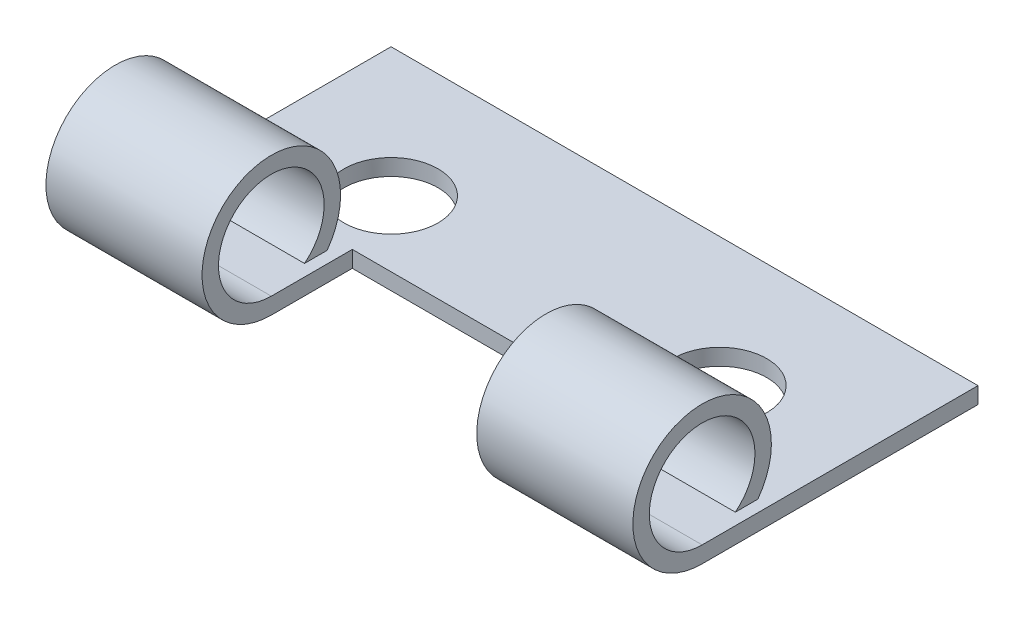
ISO-10303-21;
HEADER;
FILE_DESCRIPTION(('STEP AP214'),'2;1');
FILE_NAME('part.step','',(''),(''),'','','');
FILE_SCHEMA(('AUTOMOTIVE_DESIGN { 1 0 10303 214 1 1 1 1 }'));
ENDSEC;
DATA;
#1=APPLICATION_CONTEXT('core data for automotive mechanical design processes');
#2=APPLICATION_PROTOCOL_DEFINITION('international standard','automotive_design',2000,#1);
#3=PRODUCT_CONTEXT('',#1,'mechanical');
#4=PRODUCT('Part','Part','',(#3));
#5=PRODUCT_RELATED_PRODUCT_CATEGORY('part','',(#4));
#6=PRODUCT_DEFINITION_FORMATION('','',#4);
#7=PRODUCT_DEFINITION_CONTEXT('part definition',#1,'design');
#8=PRODUCT_DEFINITION('design','',#6,#7);
#9=PRODUCT_DEFINITION_SHAPE('','',#8);
#10=(LENGTH_UNIT() NAMED_UNIT(*) SI_UNIT(.MILLI.,.METRE.));
#11=(NAMED_UNIT(*) PLANE_ANGLE_UNIT() SI_UNIT($,.RADIAN.));
#12=(NAMED_UNIT(*) SI_UNIT($,.STERADIAN.) SOLID_ANGLE_UNIT());
#13=UNCERTAINTY_MEASURE_WITH_UNIT(LENGTH_MEASURE(1.E-05),#10,'distance_accuracy_value','');
#14=(GEOMETRIC_REPRESENTATION_CONTEXT(3) GLOBAL_UNCERTAINTY_ASSIGNED_CONTEXT((#13)) GLOBAL_UNIT_ASSIGNED_CONTEXT((#10,
#11,#12)) REPRESENTATION_CONTEXT('',''));
#15=CARTESIAN_POINT('',(0.,0.,0.));
#16=DIRECTION('',(0.,0.,1.));
#17=DIRECTION('',(1.,0.,0.));
#18=AXIS2_PLACEMENT_3D('',#15,#16,#17);
#19=CARTESIAN_POINT('',(12.5,0.,-2.25));
#20=DIRECTION('',(0.,1.,0.));
#21=DIRECTION('',(0.,0.,1.));
#22=AXIS2_PLACEMENT_3D('',#19,#20,#21);
#23=PLANE('',#22);
#24=CARTESIAN_POINT('',(-7.,0.,-8.5));
#25=DIRECTION('',(0.,1.,0.));
#26=DIRECTION('',(0.,0.,1.));
#27=AXIS2_PLACEMENT_3D('',#24,#25,#26);
#28=CIRCLE('',#27,2.);
#29=CARTESIAN_POINT('',(-7.,0.,-6.5));
#30=VERTEX_POINT('',#29);
#31=EDGE_CURVE('E261',#30,#30,#28,.F.);
#32=ORIENTED_EDGE('',*,*,#31,.F.);
#33=EDGE_LOOP('',(#32));
#34=FACE_BOUND('',#33,.T.);
#35=CARTESIAN_POINT('',(7.,0.,-8.5));
#36=DIRECTION('',(0.,1.,0.));
#37=DIRECTION('',(0.,0.,1.));
#38=AXIS2_PLACEMENT_3D('',#35,#36,#37);
#39=CIRCLE('',#38,2.);
#40=CARTESIAN_POINT('',(7.,0.,-6.5));
#41=VERTEX_POINT('',#40);
#42=EDGE_CURVE('E146',#41,#41,#39,.F.);
#43=ORIENTED_EDGE('',*,*,#42,.F.);
#44=EDGE_LOOP('',(#43));
#45=FACE_BOUND('',#44,.T.);
#46=DIRECTION('',(0.,0.,1.));
#47=VECTOR('',#46,1.);
#48=CARTESIAN_POINT('',(-5.85,0.,-5.7));
#49=LINE('',#48,#47);
#50=CARTESIAN_POINT('',(-5.85,0.,-5.7));
#51=VERTEX_POINT('',#50);
#52=CARTESIAN_POINT('',(-5.85,0.,-2.25));
#53=VERTEX_POINT('',#52);
#54=EDGE_CURVE('E181',#51,#53,#49,.T.);
#55=ORIENTED_EDGE('',*,*,#54,.T.);
#56=DIRECTION('',(-1.,0.,0.));
#57=VECTOR('',#56,1.);
#58=CARTESIAN_POINT('',(12.5,0.,-2.25));
#59=LINE('',#58,#57);
#60=CARTESIAN_POINT('',(-12.5,0.,-2.25));
#61=VERTEX_POINT('',#60);
#62=EDGE_CURVE('E95',#53,#61,#59,.T.);
#63=ORIENTED_EDGE('',*,*,#62,.T.);
#64=DIRECTION('',(0.,0.,-1.));
#65=VECTOR('',#64,1.);
#66=CARTESIAN_POINT('',(-12.5,0.,-2.25));
#67=LINE('',#66,#65);
#68=CARTESIAN_POINT('',(-12.5,0.,-14.));
#69=VERTEX_POINT('',#68);
#70=EDGE_CURVE('E143',#61,#69,#67,.T.);
#71=ORIENTED_EDGE('',*,*,#70,.T.);
#72=DIRECTION('',(-1.,0.,0.));
#73=VECTOR('',#72,1.);
#74=CARTESIAN_POINT('',(12.5,0.,-14.));
#75=LINE('',#74,#73);
#76=CARTESIAN_POINT('',(12.5,0.,-14.));
#77=VERTEX_POINT('',#76);
#78=EDGE_CURVE('E170',#77,#69,#75,.T.);
#79=ORIENTED_EDGE('',*,*,#78,.F.);
#80=DIRECTION('',(0.,0.,-1.));
#81=VECTOR('',#80,1.);
#82=CARTESIAN_POINT('',(12.5,0.,-2.25));
#83=LINE('',#82,#81);
#84=CARTESIAN_POINT('',(12.5,0.,-2.25));
#85=VERTEX_POINT('',#84);
#86=EDGE_CURVE('E159',#85,#77,#83,.T.);
#87=ORIENTED_EDGE('',*,*,#86,.F.);
#88=CARTESIAN_POINT('',(5.85,0.,-2.25));
#89=VERTEX_POINT('',#88);
#90=EDGE_CURVE('E160',#85,#89,#59,.T.);
#91=ORIENTED_EDGE('',*,*,#90,.T.);
#92=DIRECTION('',(0.,0.,-1.));
#93=VECTOR('',#92,1.);
#94=CARTESIAN_POINT('',(5.85,0.,-5.7));
#95=LINE('',#94,#93);
#96=CARTESIAN_POINT('',(5.85,0.,-5.7));
#97=VERTEX_POINT('',#96);
#98=EDGE_CURVE('E194',#89,#97,#95,.T.);
#99=ORIENTED_EDGE('',*,*,#98,.T.);
#100=DIRECTION('',(-1.,0.,0.));
#101=VECTOR('',#100,1.);
#102=CARTESIAN_POINT('',(-5.85,0.,-5.7));
#103=LINE('',#102,#101);
#104=EDGE_CURVE('E193',#97,#51,#103,.T.);
#105=ORIENTED_EDGE('',*,*,#104,.T.);
#106=EDGE_LOOP('',(#55,#63,#71,#79,#87,#91,#99,#105));
#107=FACE_BOUND('',#106,.T.);
#108=ADVANCED_FACE('F45',(#34,#45,#107),#23,.F.);
#109=CARTESIAN_POINT('',(12.5,0.700000000000002,-14.));
#110=DIRECTION('',(0.,-1.,0.));
#111=DIRECTION('',(0.,0.,-1.));
#112=AXIS2_PLACEMENT_3D('',#109,#110,#111);
#113=PLANE('',#112);
#114=CARTESIAN_POINT('',(-7.,0.700000000000001,-8.5));
#115=DIRECTION('',(0.,1.,0.));
#116=DIRECTION('',(0.,0.,-1.));
#117=AXIS2_PLACEMENT_3D('',#114,#115,#116);
#118=CIRCLE('',#117,2.);
#119=CARTESIAN_POINT('',(-7.,0.700000000000001,-10.5));
#120=VERTEX_POINT('',#119);
#121=EDGE_CURVE('E257',#120,#120,#118,.T.);
#122=ORIENTED_EDGE('',*,*,#121,.F.);
#123=EDGE_LOOP('',(#122));
#124=FACE_BOUND('',#123,.T.);
#125=CARTESIAN_POINT('',(7.,0.700000000000001,-8.5));
#126=DIRECTION('',(0.,1.,0.));
#127=DIRECTION('',(0.,0.,1.));
#128=AXIS2_PLACEMENT_3D('',#125,#126,#127);
#129=CIRCLE('',#128,2.);
#130=CARTESIAN_POINT('',(7.,0.700000000000001,-6.5));
#131=VERTEX_POINT('',#130);
#132=EDGE_CURVE('E258',#131,#131,#129,.T.);
#133=ORIENTED_EDGE('',*,*,#132,.F.);
#134=EDGE_LOOP('',(#133));
#135=FACE_BOUND('',#134,.T.);
#136=DIRECTION('',(0.,0.,1.));
#137=VECTOR('',#136,1.);
#138=CARTESIAN_POINT('',(-5.85,0.700000000000002,-14.));
#139=LINE('',#138,#137);
#140=CARTESIAN_POINT('',(-5.85,0.700000000000001,-5.7));
#141=VERTEX_POINT('',#140);
#142=CARTESIAN_POINT('',(-5.85,0.7,-2.25));
#143=VERTEX_POINT('',#142);
#144=EDGE_CURVE('E220',#141,#143,#139,.T.);
#145=ORIENTED_EDGE('',*,*,#144,.F.);
#146=DIRECTION('',(-1.,0.,0.));
#147=VECTOR('',#146,1.);
#148=CARTESIAN_POINT('',(12.5,0.700000000000001,-5.7));
#149=LINE('',#148,#147);
#150=CARTESIAN_POINT('',(5.85,0.700000000000001,-5.7));
#151=VERTEX_POINT('',#150);
#152=EDGE_CURVE('E11',#151,#141,#149,.T.);
#153=ORIENTED_EDGE('',*,*,#152,.F.);
#154=DIRECTION('',(0.,0.,-1.));
#155=VECTOR('',#154,1.);
#156=CARTESIAN_POINT('',(5.85,0.700000000000002,-14.));
#157=LINE('',#156,#155);
#158=CARTESIAN_POINT('',(5.85,0.7,-2.25));
#159=VERTEX_POINT('',#158);
#160=EDGE_CURVE('E241',#159,#151,#157,.T.);
#161=ORIENTED_EDGE('',*,*,#160,.F.);
#162=DIRECTION('',(-1.,0.,0.));
#163=VECTOR('',#162,1.);
#164=CARTESIAN_POINT('',(12.5,0.7,-2.25));
#165=LINE('',#164,#163);
#166=CARTESIAN_POINT('',(12.5,0.7,-2.25));
#167=VERTEX_POINT('',#166);
#168=EDGE_CURVE('E165',#167,#159,#165,.T.);
#169=ORIENTED_EDGE('',*,*,#168,.F.);
#170=DIRECTION('',(0.,0.,1.));
#171=VECTOR('',#170,1.);
#172=CARTESIAN_POINT('',(12.5,0.700000000000002,-14.));
#173=LINE('',#172,#171);
#174=CARTESIAN_POINT('',(12.5,0.700000000000002,-14.));
#175=VERTEX_POINT('',#174);
#176=EDGE_CURVE('E120',#175,#167,#173,.T.);
#177=ORIENTED_EDGE('',*,*,#176,.F.);
#178=DIRECTION('',(-1.,0.,0.));
#179=VECTOR('',#178,1.);
#180=CARTESIAN_POINT('',(12.5,0.700000000000002,-14.));
#181=LINE('',#180,#179);
#182=CARTESIAN_POINT('',(-12.5,0.700000000000002,-14.));
#183=VERTEX_POINT('',#182);
#184=EDGE_CURVE('E167',#175,#183,#181,.T.);
#185=ORIENTED_EDGE('',*,*,#184,.T.);
#186=DIRECTION('',(0.,0.,1.));
#187=VECTOR('',#186,1.);
#188=CARTESIAN_POINT('',(-12.5,0.700000000000002,-14.));
#189=LINE('',#188,#187);
#190=CARTESIAN_POINT('',(-12.5,0.7,-2.25));
#191=VERTEX_POINT('',#190);
#192=EDGE_CURVE('E148',#183,#191,#189,.T.);
#193=ORIENTED_EDGE('',*,*,#192,.T.);
#194=EDGE_CURVE('E134',#143,#191,#165,.T.);
#195=ORIENTED_EDGE('',*,*,#194,.F.);
#196=EDGE_LOOP('',(#145,#153,#161,#169,#177,#185,#193,#195));
#197=FACE_BOUND('',#196,.T.);
#198=ADVANCED_FACE('F208',(#124,#135,#197),#113,.F.);
#199=CARTESIAN_POINT('',(12.5,2.95,-2.25));
#200=DIRECTION('',(-1.,0.,0.));
#201=DIRECTION('',(0.,0.,1.));
#202=AXIS2_PLACEMENT_3D('',#199,#200,#201);
#203=CYLINDRICAL_SURFACE('',#202,2.25);
#204=CARTESIAN_POINT('',(-5.85,2.95,-2.25));
#205=DIRECTION('',(1.,0.,0.));
#206=DIRECTION('',(0.,0.,-1.));
#207=AXIS2_PLACEMENT_3D('',#204,#205,#206);
#208=CIRCLE('',#207,2.25);
#209=CARTESIAN_POINT('',(-5.85,1.2,-3.66421356237309));
#210=VERTEX_POINT('',#209);
#211=EDGE_CURVE('E216',#143,#210,#208,.F.);
#212=ORIENTED_EDGE('',*,*,#211,.F.);
#213=ORIENTED_EDGE('',*,*,#194,.T.);
#214=CARTESIAN_POINT('',(-12.5,2.95,-2.25));
#215=DIRECTION('',(-1.,0.,0.));
#216=DIRECTION('',(0.,0.,-1.));
#217=AXIS2_PLACEMENT_3D('',#214,#215,#216);
#218=CIRCLE('',#217,2.25);
#219=CARTESIAN_POINT('',(-12.5,1.2,-3.66421356237309));
#220=VERTEX_POINT('',#219);
#221=EDGE_CURVE('E151',#191,#220,#218,.T.);
#222=ORIENTED_EDGE('',*,*,#221,.T.);
#223=DIRECTION('',(-1.,0.,0.));
#224=VECTOR('',#223,1.);
#225=CARTESIAN_POINT('',(12.5,1.2,-3.66421356237309));
#226=LINE('',#225,#224);
#227=EDGE_CURVE('E135',#210,#220,#226,.T.);
#228=ORIENTED_EDGE('',*,*,#227,.F.);
#229=EDGE_LOOP('',(#212,#213,#222,#228));
#230=FACE_BOUND('',#229,.T.);
#231=ADVANCED_FACE('F214',(#230),#203,.F.);
#232=CARTESIAN_POINT('',(5.85,2.95,-2.25));
#233=DIRECTION('',(-1.,0.,0.));
#234=DIRECTION('',(0.,0.,1.));
#235=AXIS2_PLACEMENT_3D('',#232,#233,#234);
#236=CIRCLE('',#235,2.25);
#237=CARTESIAN_POINT('',(5.85,1.2,-3.66421356237309));
#238=VERTEX_POINT('',#237);
#239=EDGE_CURVE('E131',#238,#159,#236,.F.);
#240=ORIENTED_EDGE('',*,*,#239,.F.);
#241=CARTESIAN_POINT('',(12.5,1.2,-3.66421356237309));
#242=VERTEX_POINT('',#241);
#243=EDGE_CURVE('E127',#242,#238,#226,.T.);
#244=ORIENTED_EDGE('',*,*,#243,.F.);
#245=CARTESIAN_POINT('',(12.5,2.95,-2.25));
#246=DIRECTION('',(-1.,0.,0.));
#247=DIRECTION('',(0.,0.,-1.));
#248=AXIS2_PLACEMENT_3D('',#245,#246,#247);
#249=CIRCLE('',#248,2.25);
#250=EDGE_CURVE('E113',#167,#242,#249,.T.);
#251=ORIENTED_EDGE('',*,*,#250,.F.);
#252=ORIENTED_EDGE('',*,*,#168,.T.);
#253=EDGE_LOOP('',(#240,#244,#251,#252));
#254=FACE_BOUND('',#253,.T.);
#255=ADVANCED_FACE('F128',(#254),#203,.F.);
#256=CARTESIAN_POINT('',(12.5,1.2,-4.62486841740758));
#257=DIRECTION('',(0.,1.,0.));
#258=DIRECTION('',(0.,0.,1.));
#259=AXIS2_PLACEMENT_3D('',#256,#257,#258);
#260=PLANE('',#259);
#261=DIRECTION('',(0.,0.,-1.));
#262=VECTOR('',#261,1.);
#263=CARTESIAN_POINT('',(-5.85,1.2,-4.62486841740758));
#264=LINE('',#263,#262);
#265=CARTESIAN_POINT('',(-5.85,1.2,-4.62486841740758));
#266=VERTEX_POINT('',#265);
#267=EDGE_CURVE('E186',#210,#266,#264,.T.);
#268=ORIENTED_EDGE('',*,*,#267,.F.);
#269=ORIENTED_EDGE('',*,*,#227,.T.);
#270=DIRECTION('',(0.,0.,-1.));
#271=VECTOR('',#270,1.);
#272=CARTESIAN_POINT('',(-12.5,1.2,-4.62486841740758));
#273=LINE('',#272,#271);
#274=CARTESIAN_POINT('',(-12.5,1.2,-4.62486841740758));
#275=VERTEX_POINT('',#274);
#276=EDGE_CURVE('E154',#220,#275,#273,.T.);
#277=ORIENTED_EDGE('',*,*,#276,.T.);
#278=DIRECTION('',(-1.,0.,0.));
#279=VECTOR('',#278,1.);
#280=CARTESIAN_POINT('',(12.5,1.2,-4.62486841740758));
#281=LINE('',#280,#279);
#282=EDGE_CURVE('E163',#266,#275,#281,.T.);
#283=ORIENTED_EDGE('',*,*,#282,.F.);
#284=EDGE_LOOP('',(#268,#269,#277,#283));
#285=FACE_BOUND('',#284,.T.);
#286=ADVANCED_FACE('F298',(#285),#260,.F.);
#287=DIRECTION('',(0.,0.,1.));
#288=VECTOR('',#287,1.);
#289=CARTESIAN_POINT('',(5.85,1.2,-4.62486841740758));
#290=LINE('',#289,#288);
#291=CARTESIAN_POINT('',(5.85,1.2,-4.62486841740758));
#292=VERTEX_POINT('',#291);
#293=EDGE_CURVE('E243',#292,#238,#290,.T.);
#294=ORIENTED_EDGE('',*,*,#293,.F.);
#295=CARTESIAN_POINT('',(12.5,1.2,-4.62486841740758));
#296=VERTEX_POINT('',#295);
#297=EDGE_CURVE('E138',#296,#292,#281,.T.);
#298=ORIENTED_EDGE('',*,*,#297,.F.);
#299=DIRECTION('',(0.,0.,-1.));
#300=VECTOR('',#299,1.);
#301=CARTESIAN_POINT('',(12.5,1.2,-4.62486841740758));
#302=LINE('',#301,#300);
#303=EDGE_CURVE('E117',#242,#296,#302,.T.);
#304=ORIENTED_EDGE('',*,*,#303,.F.);
#305=ORIENTED_EDGE('',*,*,#243,.T.);
#306=EDGE_LOOP('',(#294,#298,#304,#305));
#307=FACE_BOUND('',#306,.T.);
#308=ADVANCED_FACE('F137',(#307),#260,.F.);
#309=CARTESIAN_POINT('',(12.5,2.95,-2.25));
#310=DIRECTION('',(-1.,0.,0.));
#311=DIRECTION('',(0.,0.,1.));
#312=AXIS2_PLACEMENT_3D('',#309,#310,#311);
#313=CYLINDRICAL_SURFACE('',#312,2.95);
#314=ORIENTED_EDGE('',*,*,#62,.F.);
#315=CARTESIAN_POINT('',(-5.85,2.95,-2.25));
#316=DIRECTION('',(1.,0.,0.));
#317=DIRECTION('',(0.,0.,-1.));
#318=AXIS2_PLACEMENT_3D('',#315,#316,#317);
#319=CIRCLE('',#318,2.95);
#320=EDGE_CURVE('E52',#266,#53,#319,.T.);
#321=ORIENTED_EDGE('',*,*,#320,.F.);
#322=ORIENTED_EDGE('',*,*,#282,.T.);
#323=CARTESIAN_POINT('',(-12.5,2.95,-2.25));
#324=DIRECTION('',(1.,0.,0.));
#325=DIRECTION('',(0.,0.,-1.));
#326=AXIS2_PLACEMENT_3D('',#323,#324,#325);
#327=CIRCLE('',#326,2.95);
#328=EDGE_CURVE('E157',#275,#61,#327,.T.);
#329=ORIENTED_EDGE('',*,*,#328,.T.);
#330=EDGE_LOOP('',(#314,#321,#322,#329));
#331=FACE_BOUND('',#330,.T.);
#332=ADVANCED_FACE('F196',(#331),#313,.T.);
#333=CARTESIAN_POINT('',(5.85,2.95,-2.25));
#334=DIRECTION('',(-1.,0.,0.));
#335=DIRECTION('',(0.,0.,1.));
#336=AXIS2_PLACEMENT_3D('',#333,#334,#335);
#337=CIRCLE('',#336,2.95);
#338=EDGE_CURVE('E59',#89,#292,#337,.T.);
#339=ORIENTED_EDGE('',*,*,#338,.F.);
#340=ORIENTED_EDGE('',*,*,#90,.F.);
#341=CARTESIAN_POINT('',(12.5,2.95,-2.25));
#342=DIRECTION('',(1.,0.,0.));
#343=DIRECTION('',(0.,0.,-1.));
#344=AXIS2_PLACEMENT_3D('',#341,#342,#343);
#345=CIRCLE('',#344,2.95);
#346=EDGE_CURVE('E68',#296,#85,#345,.T.);
#347=ORIENTED_EDGE('',*,*,#346,.F.);
#348=ORIENTED_EDGE('',*,*,#297,.T.);
#349=EDGE_LOOP('',(#339,#340,#347,#348));
#350=FACE_BOUND('',#349,.T.);
#351=ADVANCED_FACE('F297',(#350),#313,.T.);
#352=CARTESIAN_POINT('',(12.5,0.,-14.));
#353=DIRECTION('',(0.,0.,1.));
#354=DIRECTION('',(1.,0.,0.));
#355=AXIS2_PLACEMENT_3D('',#352,#353,#354);
#356=PLANE('',#355);
#357=DIRECTION('',(0.,1.,0.));
#358=VECTOR('',#357,1.);
#359=CARTESIAN_POINT('',(-12.5,0.,-14.));
#360=LINE('',#359,#358);
#361=EDGE_CURVE('E145',#69,#183,#360,.T.);
#362=ORIENTED_EDGE('',*,*,#361,.T.);
#363=ORIENTED_EDGE('',*,*,#184,.F.);
#364=DIRECTION('',(0.,1.,0.));
#365=VECTOR('',#364,1.);
#366=CARTESIAN_POINT('',(12.5,0.,-14.));
#367=LINE('',#366,#365);
#368=EDGE_CURVE('E104',#77,#175,#367,.T.);
#369=ORIENTED_EDGE('',*,*,#368,.F.);
#370=ORIENTED_EDGE('',*,*,#78,.T.);
#371=EDGE_LOOP('',(#362,#363,#369,#370));
#372=FACE_BOUND('',#371,.T.);
#373=ADVANCED_FACE('F205',(#372),#356,.F.);
#374=CARTESIAN_POINT('',(12.5,2.95,-2.25));
#375=DIRECTION('',(1.,0.,0.));
#376=DIRECTION('',(0.,0.,-1.));
#377=AXIS2_PLACEMENT_3D('',#374,#375,#376);
#378=PLANE('',#377);
#379=ORIENTED_EDGE('',*,*,#86,.T.);
#380=ORIENTED_EDGE('',*,*,#368,.T.);
#381=ORIENTED_EDGE('',*,*,#176,.T.);
#382=ORIENTED_EDGE('',*,*,#250,.T.);
#383=ORIENTED_EDGE('',*,*,#303,.T.);
#384=ORIENTED_EDGE('',*,*,#346,.T.);
#385=EDGE_LOOP('',(#379,#380,#381,#382,#383,#384));
#386=FACE_BOUND('',#385,.T.);
#387=ADVANCED_FACE('F115',(#386),#378,.T.);
#388=CARTESIAN_POINT('',(-12.5,2.95,-2.25));
#389=DIRECTION('',(1.,0.,0.));
#390=DIRECTION('',(0.,0.,-1.));
#391=AXIS2_PLACEMENT_3D('',#388,#389,#390);
#392=PLANE('',#391);
#393=ORIENTED_EDGE('',*,*,#70,.F.);
#394=ORIENTED_EDGE('',*,*,#328,.F.);
#395=ORIENTED_EDGE('',*,*,#276,.F.);
#396=ORIENTED_EDGE('',*,*,#221,.F.);
#397=ORIENTED_EDGE('',*,*,#192,.F.);
#398=ORIENTED_EDGE('',*,*,#361,.F.);
#399=EDGE_LOOP('',(#393,#394,#395,#396,#397,#398));
#400=FACE_BOUND('',#399,.T.);
#401=ADVANCED_FACE('F201',(#400),#392,.F.);
#402=CARTESIAN_POINT('',(-7.,-0.00100000000000078,-8.5));
#403=DIRECTION('',(0.,1.,0.));
#404=DIRECTION('',(0.,0.,1.));
#405=AXIS2_PLACEMENT_3D('',#402,#403,#404);
#406=CYLINDRICAL_SURFACE('',#405,2.);
#407=ORIENTED_EDGE('',*,*,#121,.T.);
#408=EDGE_LOOP('',(#407));
#409=FACE_BOUND('',#408,.T.);
#410=ORIENTED_EDGE('',*,*,#31,.T.);
#411=EDGE_LOOP('',(#410));
#412=FACE_BOUND('',#411,.T.);
#413=ADVANCED_FACE('F271',(#409,#412),#406,.F.);
#414=CARTESIAN_POINT('',(7.,-0.00100000000000078,-8.5));
#415=DIRECTION('',(0.,1.,0.));
#416=DIRECTION('',(0.,0.,1.));
#417=AXIS2_PLACEMENT_3D('',#414,#415,#416);
#418=CYLINDRICAL_SURFACE('',#417,2.);
#419=ORIENTED_EDGE('',*,*,#132,.T.);
#420=EDGE_LOOP('',(#419));
#421=FACE_BOUND('',#420,.T.);
#422=ORIENTED_EDGE('',*,*,#42,.T.);
#423=EDGE_LOOP('',(#422));
#424=FACE_BOUND('',#423,.T.);
#425=ADVANCED_FACE('F277',(#421,#424),#418,.F.);
#426=CARTESIAN_POINT('',(-5.85,5.9,-5.7));
#427=DIRECTION('',(0.,0.,1.));
#428=DIRECTION('',(0.,-1.,0.));
#429=AXIS2_PLACEMENT_3D('',#426,#427,#428);
#430=PLANE('',#429);
#431=ORIENTED_EDGE('',*,*,#152,.T.);
#432=DIRECTION('',(0.,-1.,0.));
#433=VECTOR('',#432,1.);
#434=CARTESIAN_POINT('',(-5.85,5.9,-5.7));
#435=LINE('',#434,#433);
#436=EDGE_CURVE('E244',#141,#51,#435,.T.);
#437=ORIENTED_EDGE('',*,*,#436,.T.);
#438=ORIENTED_EDGE('',*,*,#104,.F.);
#439=DIRECTION('',(0.,-1.,0.));
#440=VECTOR('',#439,1.);
#441=CARTESIAN_POINT('',(5.85,5.9,-5.7));
#442=LINE('',#441,#440);
#443=EDGE_CURVE('E238',#151,#97,#442,.T.);
#444=ORIENTED_EDGE('',*,*,#443,.F.);
#445=EDGE_LOOP('',(#431,#437,#438,#444));
#446=FACE_BOUND('',#445,.T.);
#447=ADVANCED_FACE('F246',(#446),#430,.T.);
#448=CARTESIAN_POINT('',(-5.85,5.9,-5.7));
#449=DIRECTION('',(1.,0.,0.));
#450=DIRECTION('',(0.,0.,-1.));
#451=AXIS2_PLACEMENT_3D('',#448,#449,#450);
#452=PLANE('',#451);
#453=ORIENTED_EDGE('',*,*,#320,.T.);
#454=ORIENTED_EDGE('',*,*,#54,.F.);
#455=ORIENTED_EDGE('',*,*,#436,.F.);
#456=ORIENTED_EDGE('',*,*,#144,.T.);
#457=ORIENTED_EDGE('',*,*,#211,.T.);
#458=ORIENTED_EDGE('',*,*,#267,.T.);
#459=EDGE_LOOP('',(#453,#454,#455,#456,#457,#458));
#460=FACE_BOUND('',#459,.T.);
#461=ADVANCED_FACE('F178',(#460),#452,.T.);
#462=CARTESIAN_POINT('',(5.85,5.9,-5.7));
#463=DIRECTION('',(-1.,0.,0.));
#464=DIRECTION('',(0.,0.,1.));
#465=AXIS2_PLACEMENT_3D('',#462,#463,#464);
#466=PLANE('',#465);
#467=ORIENTED_EDGE('',*,*,#160,.T.);
#468=ORIENTED_EDGE('',*,*,#443,.T.);
#469=ORIENTED_EDGE('',*,*,#98,.F.);
#470=ORIENTED_EDGE('',*,*,#338,.T.);
#471=ORIENTED_EDGE('',*,*,#293,.T.);
#472=ORIENTED_EDGE('',*,*,#239,.T.);
#473=EDGE_LOOP('',(#467,#468,#469,#470,#471,#472));
#474=FACE_BOUND('',#473,.T.);
#475=ADVANCED_FACE('F239',(#474),#466,.T.);
#476=CLOSED_SHELL('',(#108,#198,#231,#255,#286,#308,#332,#351,#373,#387,#401,#413,#425,#447,
#461,#475));
#477=MANIFOLD_SOLID_BREP('B2',#476);
#478=ADVANCED_BREP_SHAPE_REPRESENTATION('',(#18,#477),#14);
#479=SHAPE_DEFINITION_REPRESENTATION(#9,#478);
ENDSEC;
END-ISO-10303-21;
